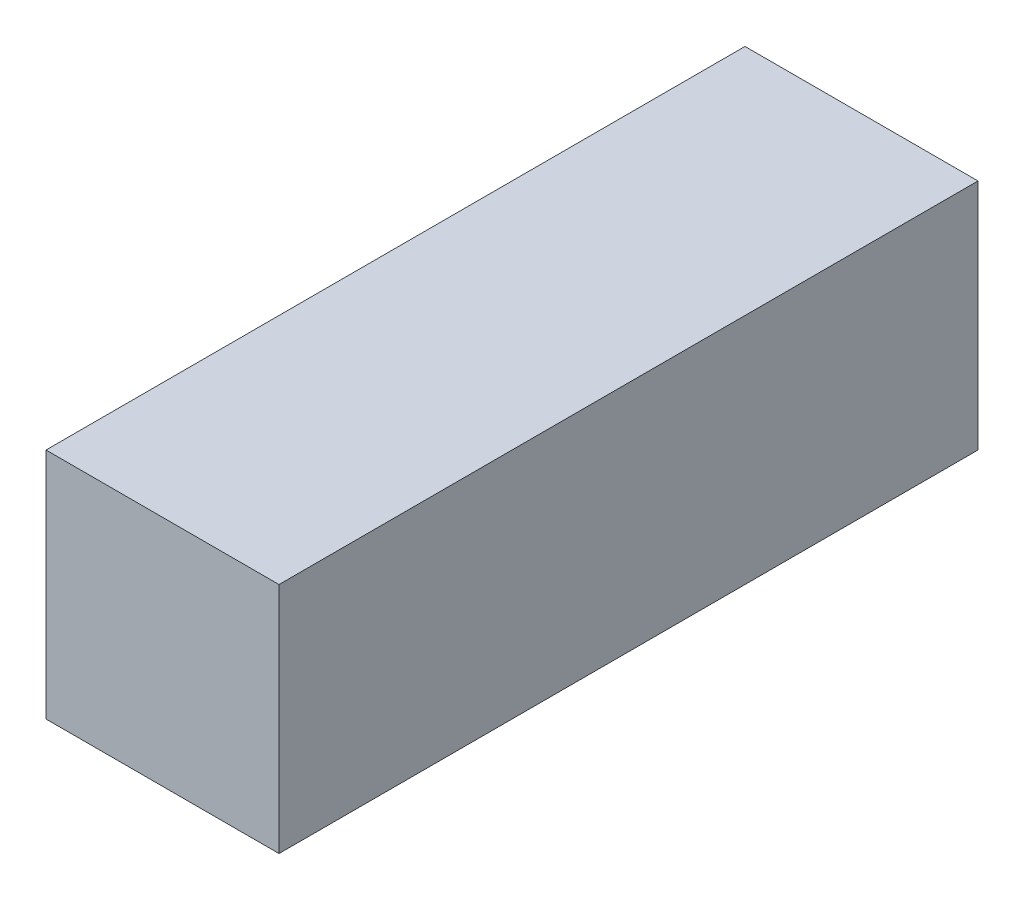
ISO-10303-21;
HEADER;
FILE_DESCRIPTION(('STEP AP214'),'2;1');
FILE_NAME('part.step','',(''),(''),'','','');
FILE_SCHEMA(('AUTOMOTIVE_DESIGN { 1 0 10303 214 1 1 1 1 }'));
ENDSEC;
DATA;
#1=APPLICATION_CONTEXT('core data for automotive mechanical design processes');
#2=APPLICATION_PROTOCOL_DEFINITION('international standard','automotive_design',2000,#1);
#3=PRODUCT_CONTEXT('',#1,'mechanical');
#4=PRODUCT('Part','Part','',(#3));
#5=PRODUCT_RELATED_PRODUCT_CATEGORY('part','',(#4));
#6=PRODUCT_DEFINITION_FORMATION('','',#4);
#7=PRODUCT_DEFINITION_CONTEXT('part definition',#1,'design');
#8=PRODUCT_DEFINITION('design','',#6,#7);
#9=PRODUCT_DEFINITION_SHAPE('','',#8);
#10=(LENGTH_UNIT() NAMED_UNIT(*) SI_UNIT(.MILLI.,.METRE.));
#11=(NAMED_UNIT(*) PLANE_ANGLE_UNIT() SI_UNIT($,.RADIAN.));
#12=(NAMED_UNIT(*) SI_UNIT($,.STERADIAN.) SOLID_ANGLE_UNIT());
#13=UNCERTAINTY_MEASURE_WITH_UNIT(LENGTH_MEASURE(1.E-05),#10,'distance_accuracy_value','');
#14=(GEOMETRIC_REPRESENTATION_CONTEXT(3) GLOBAL_UNCERTAINTY_ASSIGNED_CONTEXT((#13)) GLOBAL_UNIT_ASSIGNED_CONTEXT((#10,
#11,#12)) REPRESENTATION_CONTEXT('',''));
#15=CARTESIAN_POINT('',(0.,0.,0.));
#16=DIRECTION('',(0.,0.,1.));
#17=DIRECTION('',(1.,0.,0.));
#18=AXIS2_PLACEMENT_3D('',#15,#16,#17);
#19=CARTESIAN_POINT('',(25.,-25.,-150.));
#20=DIRECTION('',(1.,0.,0.));
#21=DIRECTION('',(0.,0.,-1.));
#22=AXIS2_PLACEMENT_3D('',#19,#20,#21);
#23=PLANE('',#22);
#24=DIRECTION('',(0.,1.,0.));
#25=VECTOR('',#24,1.);
#26=CARTESIAN_POINT('',(25.,-25.,0.));
#27=LINE('',#26,#25);
#28=CARTESIAN_POINT('',(25.,-25.,0.));
#29=VERTEX_POINT('',#28);
#30=CARTESIAN_POINT('',(25.,25.,0.));
#31=VERTEX_POINT('',#30);
#32=EDGE_CURVE('E111',#29,#31,#27,.T.);
#33=ORIENTED_EDGE('',*,*,#32,.F.);
#34=DIRECTION('',(0.,0.,1.));
#35=VECTOR('',#34,1.);
#36=CARTESIAN_POINT('',(25.,-25.,-150.));
#37=LINE('',#36,#35);
#38=CARTESIAN_POINT('',(25.,-25.,-150.));
#39=VERTEX_POINT('',#38);
#40=EDGE_CURVE('E11',#39,#29,#37,.T.);
#41=ORIENTED_EDGE('',*,*,#40,.F.);
#42=DIRECTION('',(0.,1.,0.));
#43=VECTOR('',#42,1.);
#44=CARTESIAN_POINT('',(25.,-25.,-150.));
#45=LINE('',#44,#43);
#46=CARTESIAN_POINT('',(25.,25.,-150.));
#47=VERTEX_POINT('',#46);
#48=EDGE_CURVE('E102',#39,#47,#45,.T.);
#49=ORIENTED_EDGE('',*,*,#48,.T.);
#50=DIRECTION('',(0.,0.,1.));
#51=VECTOR('',#50,1.);
#52=CARTESIAN_POINT('',(25.,25.,-150.));
#53=LINE('',#52,#51);
#54=EDGE_CURVE('E43',#47,#31,#53,.T.);
#55=ORIENTED_EDGE('',*,*,#54,.T.);
#56=EDGE_LOOP('',(#33,#41,#49,#55));
#57=FACE_BOUND('',#56,.T.);
#58=ADVANCED_FACE('F40',(#57),#23,.T.);
#59=CARTESIAN_POINT('',(-25.,-25.,-150.));
#60=DIRECTION('',(0.,-1.,0.));
#61=DIRECTION('',(0.,0.,-1.));
#62=AXIS2_PLACEMENT_3D('',#59,#60,#61);
#63=PLANE('',#62);
#64=DIRECTION('',(1.,0.,0.));
#65=VECTOR('',#64,1.);
#66=CARTESIAN_POINT('',(-25.,-25.,0.));
#67=LINE('',#66,#65);
#68=CARTESIAN_POINT('',(-25.,-25.,0.));
#69=VERTEX_POINT('',#68);
#70=EDGE_CURVE('E106',#69,#29,#67,.T.);
#71=ORIENTED_EDGE('',*,*,#70,.F.);
#72=DIRECTION('',(0.,0.,1.));
#73=VECTOR('',#72,1.);
#74=CARTESIAN_POINT('',(-25.,-25.,-150.));
#75=LINE('',#74,#73);
#76=CARTESIAN_POINT('',(-25.,-25.,-150.));
#77=VERTEX_POINT('',#76);
#78=EDGE_CURVE('E50',#77,#69,#75,.T.);
#79=ORIENTED_EDGE('',*,*,#78,.F.);
#80=DIRECTION('',(1.,0.,0.));
#81=VECTOR('',#80,1.);
#82=CARTESIAN_POINT('',(-25.,-25.,-150.));
#83=LINE('',#82,#81);
#84=EDGE_CURVE('E97',#77,#39,#83,.T.);
#85=ORIENTED_EDGE('',*,*,#84,.T.);
#86=ORIENTED_EDGE('',*,*,#40,.T.);
#87=EDGE_LOOP('',(#71,#79,#85,#86));
#88=FACE_BOUND('',#87,.T.);
#89=ADVANCED_FACE('F133',(#88),#63,.T.);
#90=CARTESIAN_POINT('',(-25.,-25.,-150.));
#91=DIRECTION('',(-1.,0.,0.));
#92=DIRECTION('',(0.,0.,1.));
#93=AXIS2_PLACEMENT_3D('',#90,#91,#92);
#94=PLANE('',#93);
#95=DIRECTION('',(0.,-1.,0.));
#96=VECTOR('',#95,1.);
#97=CARTESIAN_POINT('',(-25.,-25.,0.));
#98=LINE('',#97,#96);
#99=CARTESIAN_POINT('',(-25.,25.,0.));
#100=VERTEX_POINT('',#99);
#101=EDGE_CURVE('E91',#100,#69,#98,.T.);
#102=ORIENTED_EDGE('',*,*,#101,.F.);
#103=DIRECTION('',(0.,0.,1.));
#104=VECTOR('',#103,1.);
#105=CARTESIAN_POINT('',(-25.,25.,-150.));
#106=LINE('',#105,#104);
#107=CARTESIAN_POINT('',(-25.,25.,-150.));
#108=VERTEX_POINT('',#107);
#109=EDGE_CURVE('E86',#108,#100,#106,.T.);
#110=ORIENTED_EDGE('',*,*,#109,.F.);
#111=DIRECTION('',(0.,-1.,0.));
#112=VECTOR('',#111,1.);
#113=CARTESIAN_POINT('',(-25.,-25.,-150.));
#114=LINE('',#113,#112);
#115=EDGE_CURVE('E89',#108,#77,#114,.T.);
#116=ORIENTED_EDGE('',*,*,#115,.T.);
#117=ORIENTED_EDGE('',*,*,#78,.T.);
#118=EDGE_LOOP('',(#102,#110,#116,#117));
#119=FACE_BOUND('',#118,.T.);
#120=ADVANCED_FACE('F88',(#119),#94,.T.);
#121=CARTESIAN_POINT('',(-25.,25.,-150.));
#122=DIRECTION('',(0.,1.,0.));
#123=DIRECTION('',(0.,0.,1.));
#124=AXIS2_PLACEMENT_3D('',#121,#122,#123);
#125=PLANE('',#124);
#126=DIRECTION('',(-1.,0.,0.));
#127=VECTOR('',#126,1.);
#128=CARTESIAN_POINT('',(-25.,25.,0.));
#129=LINE('',#128,#127);
#130=EDGE_CURVE('E115',#31,#100,#129,.T.);
#131=ORIENTED_EDGE('',*,*,#130,.F.);
#132=ORIENTED_EDGE('',*,*,#54,.F.);
#133=DIRECTION('',(-1.,0.,0.));
#134=VECTOR('',#133,1.);
#135=CARTESIAN_POINT('',(-25.,25.,-150.));
#136=LINE('',#135,#134);
#137=EDGE_CURVE('E96',#47,#108,#136,.T.);
#138=ORIENTED_EDGE('',*,*,#137,.T.);
#139=ORIENTED_EDGE('',*,*,#109,.T.);
#140=EDGE_LOOP('',(#131,#132,#138,#139));
#141=FACE_BOUND('',#140,.T.);
#142=ADVANCED_FACE('F100',(#141),#125,.T.);
#143=CARTESIAN_POINT('',(0.,0.,-150.));
#144=DIRECTION('',(0.,0.,-1.));
#145=DIRECTION('',(-1.,0.,0.));
#146=AXIS2_PLACEMENT_3D('',#143,#144,#145);
#147=PLANE('',#146);
#148=ORIENTED_EDGE('',*,*,#48,.F.);
#149=ORIENTED_EDGE('',*,*,#84,.F.);
#150=ORIENTED_EDGE('',*,*,#115,.F.);
#151=ORIENTED_EDGE('',*,*,#137,.F.);
#152=EDGE_LOOP('',(#148,#149,#150,#151));
#153=FACE_BOUND('',#152,.T.);
#154=ADVANCED_FACE('F95',(#153),#147,.T.);
#155=CARTESIAN_POINT('',(0.,0.,0.));
#156=DIRECTION('',(0.,0.,-1.));
#157=DIRECTION('',(-1.,0.,0.));
#158=AXIS2_PLACEMENT_3D('',#155,#156,#157);
#159=PLANE('',#158);
#160=ORIENTED_EDGE('',*,*,#32,.T.);
#161=ORIENTED_EDGE('',*,*,#130,.T.);
#162=ORIENTED_EDGE('',*,*,#101,.T.);
#163=ORIENTED_EDGE('',*,*,#70,.T.);
#164=EDGE_LOOP('',(#160,#161,#162,#163));
#165=FACE_BOUND('',#164,.T.);
#166=ADVANCED_FACE('F132',(#165),#159,.F.);
#167=CLOSED_SHELL('',(#58,#89,#120,#142,#154,#166));
#168=MANIFOLD_SOLID_BREP('B2',#167);
#169=ADVANCED_BREP_SHAPE_REPRESENTATION('',(#18,#168),#14);
#170=SHAPE_DEFINITION_REPRESENTATION(#9,#169);
ENDSEC;
END-ISO-10303-21;
